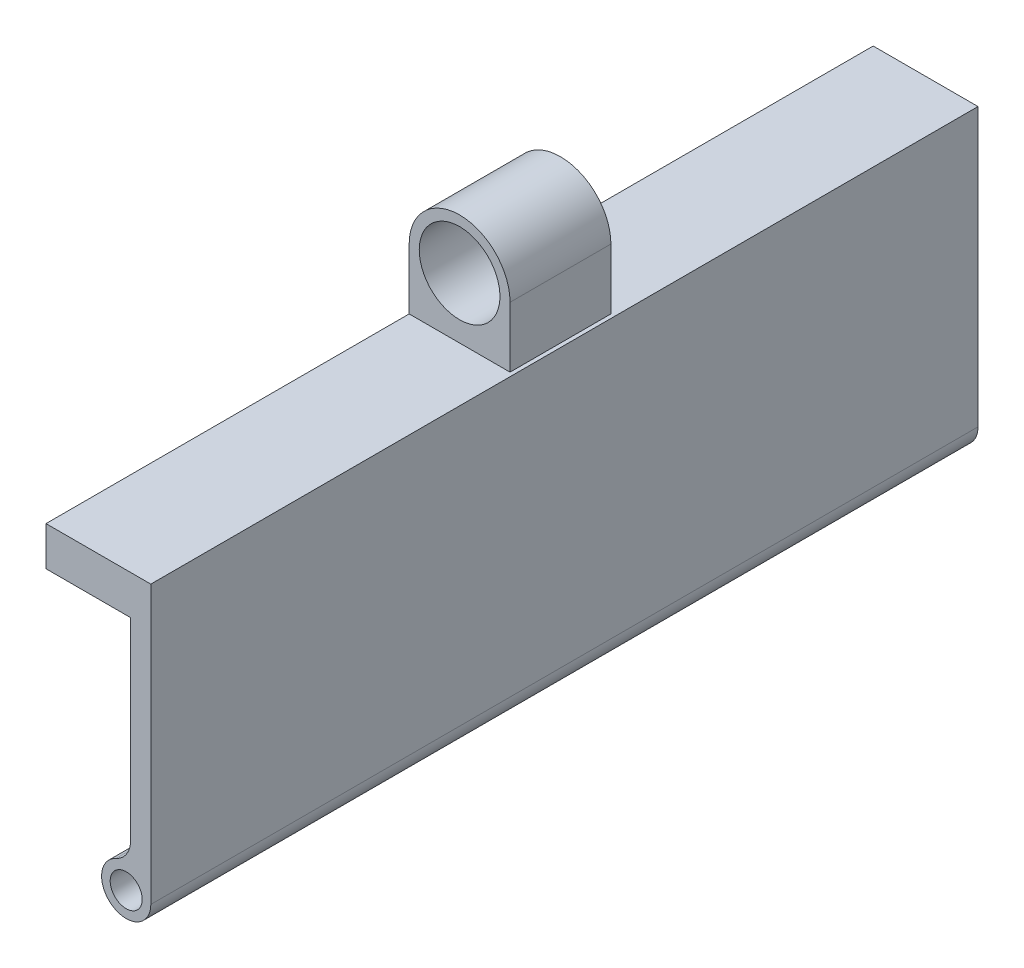
ISO-10303-21;
HEADER;
FILE_DESCRIPTION(('STEP AP214'),'2;1');
FILE_NAME('part.step','',(''),(''),'','','');
FILE_SCHEMA(('AUTOMOTIVE_DESIGN { 1 0 10303 214 1 1 1 1 }'));
ENDSEC;
DATA;
#1=APPLICATION_CONTEXT('core data for automotive mechanical design processes');
#2=APPLICATION_PROTOCOL_DEFINITION('international standard','automotive_design',2000,#1);
#3=PRODUCT_CONTEXT('',#1,'mechanical');
#4=PRODUCT('Part','Part','',(#3));
#5=PRODUCT_RELATED_PRODUCT_CATEGORY('part','',(#4));
#6=PRODUCT_DEFINITION_FORMATION('','',#4);
#7=PRODUCT_DEFINITION_CONTEXT('part definition',#1,'design');
#8=PRODUCT_DEFINITION('design','',#6,#7);
#9=PRODUCT_DEFINITION_SHAPE('','',#8);
#10=(LENGTH_UNIT() NAMED_UNIT(*) SI_UNIT(.MILLI.,.METRE.));
#11=(NAMED_UNIT(*) PLANE_ANGLE_UNIT() SI_UNIT($,.RADIAN.));
#12=(NAMED_UNIT(*) SI_UNIT($,.STERADIAN.) SOLID_ANGLE_UNIT());
#13=UNCERTAINTY_MEASURE_WITH_UNIT(LENGTH_MEASURE(1.E-05),#10,'distance_accuracy_value','');
#14=(GEOMETRIC_REPRESENTATION_CONTEXT(3) GLOBAL_UNCERTAINTY_ASSIGNED_CONTEXT((#13)) GLOBAL_UNIT_ASSIGNED_CONTEXT((#10,
#11,#12)) REPRESENTATION_CONTEXT('',''));
#15=CARTESIAN_POINT('',(0.,0.,0.));
#16=DIRECTION('',(0.,0.,1.));
#17=DIRECTION('',(1.,0.,0.));
#18=AXIS2_PLACEMENT_3D('',#15,#16,#17);
#19=CARTESIAN_POINT('',(0.,0.,82.));
#20=DIRECTION('',(0.,0.,-1.));
#21=DIRECTION('',(-1.,0.,0.));
#22=AXIS2_PLACEMENT_3D('',#19,#20,#21);
#23=CYLINDRICAL_SURFACE('',#22,2.44);
#24=DIRECTION('',(0.,0.,-1.));
#25=VECTOR('',#24,1.);
#26=CARTESIAN_POINT('',(-1.01748987854251,2.21772729321338,82.));
#27=LINE('',#26,#25);
#28=CARTESIAN_POINT('',(-1.01748987854251,2.21772729321338,58.60161));
#29=VERTEX_POINT('',#28);
#30=CARTESIAN_POINT('',(-1.01748987854251,2.21772729321338,46.881288));
#31=VERTEX_POINT('',#30);
#32=EDGE_CURVE('E425',#29,#31,#27,.T.);
#33=ORIENTED_EDGE('',*,*,#32,.T.);
#34=CARTESIAN_POINT('',(0.,0.,46.881288));
#35=DIRECTION('',(0.,0.,-1.));
#36=DIRECTION('',(-1.,0.,0.));
#37=AXIS2_PLACEMENT_3D('',#34,#35,#36);
#38=CIRCLE('',#37,2.44);
#39=CARTESIAN_POINT('',(0.44,-2.4,46.881288));
#40=VERTEX_POINT('',#39);
#41=EDGE_CURVE('E310',#40,#31,#38,.T.);
#42=ORIENTED_EDGE('',*,*,#41,.F.);
#43=DIRECTION('',(0.,0.,-1.));
#44=VECTOR('',#43,1.);
#45=CARTESIAN_POINT('',(0.44,-2.4,82.));
#46=LINE('',#45,#44);
#47=CARTESIAN_POINT('',(0.44,-2.4,35.160966));
#48=VERTEX_POINT('',#47);
#49=EDGE_CURVE('E316',#48,#40,#46,.F.);
#50=ORIENTED_EDGE('',*,*,#49,.F.);
#51=CARTESIAN_POINT('',(0.,0.,35.160966));
#52=DIRECTION('',(0.,0.,1.));
#53=DIRECTION('',(0.,-1.,0.));
#54=AXIS2_PLACEMENT_3D('',#51,#52,#53);
#55=CIRCLE('',#54,2.44);
#56=CARTESIAN_POINT('',(-1.01748987854251,2.21772729321338,35.160966));
#57=VERTEX_POINT('',#56);
#58=EDGE_CURVE('E231',#57,#48,#55,.T.);
#59=ORIENTED_EDGE('',*,*,#58,.F.);
#60=CARTESIAN_POINT('',(-1.01748987854251,2.21772729321338,23.440644));
#61=VERTEX_POINT('',#60);
#62=EDGE_CURVE('E230',#57,#61,#27,.T.);
#63=ORIENTED_EDGE('',*,*,#62,.T.);
#64=CARTESIAN_POINT('',(0.,0.,23.440644));
#65=DIRECTION('',(0.,0.,-1.));
#66=DIRECTION('',(-1.,0.,0.));
#67=AXIS2_PLACEMENT_3D('',#64,#65,#66);
#68=CIRCLE('',#67,2.44);
#69=CARTESIAN_POINT('',(0.44,-2.4,23.440644));
#70=VERTEX_POINT('',#69);
#71=EDGE_CURVE('E328',#70,#61,#68,.T.);
#72=ORIENTED_EDGE('',*,*,#71,.F.);
#73=DIRECTION('',(0.,0.,-1.));
#74=VECTOR('',#73,1.);
#75=CARTESIAN_POINT('',(0.44,-2.4,82.));
#76=LINE('',#75,#74);
#77=CARTESIAN_POINT('',(0.44,-2.4,11.720322));
#78=VERTEX_POINT('',#77);
#79=EDGE_CURVE('E324',#78,#70,#76,.F.);
#80=ORIENTED_EDGE('',*,*,#79,.F.);
#81=CARTESIAN_POINT('',(0.,0.,11.720322));
#82=DIRECTION('',(0.,0.,1.));
#83=DIRECTION('',(0.,-1.,0.));
#84=AXIS2_PLACEMENT_3D('',#81,#82,#83);
#85=CIRCLE('',#84,2.44);
#86=CARTESIAN_POINT('',(-1.01748987854251,2.21772729321338,11.720322));
#87=VERTEX_POINT('',#86);
#88=EDGE_CURVE('E334',#87,#78,#85,.T.);
#89=ORIENTED_EDGE('',*,*,#88,.F.);
#90=CARTESIAN_POINT('',(-1.01748987854251,2.21772729321338,0.));
#91=VERTEX_POINT('',#90);
#92=EDGE_CURVE('E416',#87,#91,#27,.T.);
#93=ORIENTED_EDGE('',*,*,#92,.T.);
#94=CARTESIAN_POINT('',(0.,0.,0.));
#95=DIRECTION('',(0.,0.,1.));
#96=DIRECTION('',(1.,0.,0.));
#97=AXIS2_PLACEMENT_3D('',#94,#95,#96);
#98=CIRCLE('',#97,2.44);
#99=CARTESIAN_POINT('',(2.44,0.,0.));
#100=VERTEX_POINT('',#99);
#101=EDGE_CURVE('E403',#91,#100,#98,.T.);
#102=ORIENTED_EDGE('',*,*,#101,.T.);
#103=DIRECTION('',(0.,0.,-1.));
#104=VECTOR('',#103,1.);
#105=CARTESIAN_POINT('',(2.44,0.,82.));
#106=LINE('',#105,#104);
#107=CARTESIAN_POINT('',(2.44,0.,82.));
#108=VERTEX_POINT('',#107);
#109=EDGE_CURVE('E247',#108,#100,#106,.T.);
#110=ORIENTED_EDGE('',*,*,#109,.F.);
#111=CARTESIAN_POINT('',(0.,0.,82.));
#112=DIRECTION('',(0.,0.,1.));
#113=DIRECTION('',(1.,0.,0.));
#114=AXIS2_PLACEMENT_3D('',#111,#112,#113);
#115=CIRCLE('',#114,2.44);
#116=CARTESIAN_POINT('',(-1.01748987854251,2.21772729321338,82.));
#117=VERTEX_POINT('',#116);
#118=EDGE_CURVE('E406',#117,#108,#115,.T.);
#119=ORIENTED_EDGE('',*,*,#118,.F.);
#120=CARTESIAN_POINT('',(-1.01748987854251,2.21772729321338,70.321932));
#121=VERTEX_POINT('',#120);
#122=EDGE_CURVE('E243',#117,#121,#27,.T.);
#123=ORIENTED_EDGE('',*,*,#122,.T.);
#124=CARTESIAN_POINT('',(0.,0.,70.321932));
#125=DIRECTION('',(0.,0.,-1.));
#126=DIRECTION('',(-1.,0.,0.));
#127=AXIS2_PLACEMENT_3D('',#124,#125,#126);
#128=CIRCLE('',#127,2.44);
#129=CARTESIAN_POINT('',(0.44,-2.4,70.321932));
#130=VERTEX_POINT('',#129);
#131=EDGE_CURVE('E296',#130,#121,#128,.T.);
#132=ORIENTED_EDGE('',*,*,#131,.F.);
#133=DIRECTION('',(0.,0.,-1.));
#134=VECTOR('',#133,1.);
#135=CARTESIAN_POINT('',(0.44,-2.4,82.));
#136=LINE('',#135,#134);
#137=CARTESIAN_POINT('',(0.44,-2.4,58.60161));
#138=VERTEX_POINT('',#137);
#139=EDGE_CURVE('E314',#138,#130,#136,.F.);
#140=ORIENTED_EDGE('',*,*,#139,.F.);
#141=CARTESIAN_POINT('',(0.,0.,58.60161));
#142=DIRECTION('',(0.,0.,1.));
#143=DIRECTION('',(0.,-1.,0.));
#144=AXIS2_PLACEMENT_3D('',#141,#142,#143);
#145=CIRCLE('',#144,2.44);
#146=EDGE_CURVE('E304',#29,#138,#145,.T.);
#147=ORIENTED_EDGE('',*,*,#146,.F.);
#148=EDGE_LOOP('',(#33,#42,#50,#59,#63,#72,#80,#89,#93,#102,#110,#119,#123,#132,#140,#147));
#149=FACE_BOUND('',#148,.T.);
#150=ADVANCED_FACE('F40',(#149),#23,.T.);
#151=CARTESIAN_POINT('',(-2.06,4.48998886412873,82.));
#152=DIRECTION('',(0.,0.,-1.));
#153=DIRECTION('',(-1.,0.,0.));
#154=AXIS2_PLACEMENT_3D('',#151,#152,#153);
#155=CYLINDRICAL_SURFACE('',#154,2.5);
#156=CARTESIAN_POINT('',(-2.06,4.48998886412873,35.160966));
#157=DIRECTION('',(0.,0.,1.));
#158=DIRECTION('',(0.,-1.,0.));
#159=AXIS2_PLACEMENT_3D('',#156,#157,#158);
#160=CIRCLE('',#159,2.5);
#161=CARTESIAN_POINT('',(0.44,4.48998886412873,35.160966));
#162=VERTEX_POINT('',#161);
#163=EDGE_CURVE('E215',#162,#57,#160,.F.);
#164=ORIENTED_EDGE('',*,*,#163,.F.);
#165=DIRECTION('',(0.,0.,-1.));
#166=VECTOR('',#165,1.);
#167=CARTESIAN_POINT('',(0.44,4.48998886412873,82.));
#168=LINE('',#167,#166);
#169=CARTESIAN_POINT('',(0.44,4.48998886412873,23.440644));
#170=VERTEX_POINT('',#169);
#171=EDGE_CURVE('E228',#162,#170,#168,.T.);
#172=ORIENTED_EDGE('',*,*,#171,.T.);
#173=CARTESIAN_POINT('',(-2.06,4.48998886412873,23.440644));
#174=DIRECTION('',(0.,0.,-1.));
#175=DIRECTION('',(-1.,0.,0.));
#176=AXIS2_PLACEMENT_3D('',#173,#174,#175);
#177=CIRCLE('',#176,2.5);
#178=EDGE_CURVE('E326',#61,#170,#177,.F.);
#179=ORIENTED_EDGE('',*,*,#178,.F.);
#180=ORIENTED_EDGE('',*,*,#62,.F.);
#181=EDGE_LOOP('',(#164,#172,#179,#180));
#182=FACE_BOUND('',#181,.T.);
#183=ADVANCED_FACE('F226',(#182),#155,.F.);
#184=CARTESIAN_POINT('',(-2.06,4.48998886412873,46.881288));
#185=DIRECTION('',(0.,0.,-1.));
#186=DIRECTION('',(-1.,0.,0.));
#187=AXIS2_PLACEMENT_3D('',#184,#185,#186);
#188=CIRCLE('',#187,2.5);
#189=CARTESIAN_POINT('',(0.44,4.48998886412873,46.881288));
#190=VERTEX_POINT('',#189);
#191=EDGE_CURVE('E307',#31,#190,#188,.F.);
#192=ORIENTED_EDGE('',*,*,#191,.F.);
#193=ORIENTED_EDGE('',*,*,#32,.F.);
#194=CARTESIAN_POINT('',(-2.06,4.48998886412873,58.60161));
#195=DIRECTION('',(0.,0.,1.));
#196=DIRECTION('',(0.,-1.,0.));
#197=AXIS2_PLACEMENT_3D('',#194,#195,#196);
#198=CIRCLE('',#197,2.5);
#199=CARTESIAN_POINT('',(0.44,4.48998886412873,58.60161));
#200=VERTEX_POINT('',#199);
#201=EDGE_CURVE('E301',#200,#29,#198,.F.);
#202=ORIENTED_EDGE('',*,*,#201,.F.);
#203=EDGE_CURVE('E238',#200,#190,#168,.T.);
#204=ORIENTED_EDGE('',*,*,#203,.T.);
#205=EDGE_LOOP('',(#192,#193,#202,#204));
#206=FACE_BOUND('',#205,.T.);
#207=ADVANCED_FACE('F473',(#206),#155,.F.);
#208=CARTESIAN_POINT('',(-2.06,4.48998886412873,70.321932));
#209=DIRECTION('',(0.,0.,-1.));
#210=DIRECTION('',(-1.,0.,0.));
#211=AXIS2_PLACEMENT_3D('',#208,#209,#210);
#212=CIRCLE('',#211,2.5);
#213=CARTESIAN_POINT('',(0.44,4.48998886412873,70.321932));
#214=VERTEX_POINT('',#213);
#215=EDGE_CURVE('E293',#121,#214,#212,.F.);
#216=ORIENTED_EDGE('',*,*,#215,.F.);
#217=ORIENTED_EDGE('',*,*,#122,.F.);
#218=CARTESIAN_POINT('',(-2.06,4.48998886412873,82.));
#219=DIRECTION('',(0.,0.,-1.));
#220=DIRECTION('',(-1.,0.,0.));
#221=AXIS2_PLACEMENT_3D('',#218,#219,#220);
#222=CIRCLE('',#221,2.5);
#223=CARTESIAN_POINT('',(0.44,4.48998886412873,82.));
#224=VERTEX_POINT('',#223);
#225=EDGE_CURVE('E414',#224,#117,#222,.T.);
#226=ORIENTED_EDGE('',*,*,#225,.F.);
#227=EDGE_CURVE('E241',#224,#214,#168,.T.);
#228=ORIENTED_EDGE('',*,*,#227,.T.);
#229=EDGE_LOOP('',(#216,#217,#226,#228));
#230=FACE_BOUND('',#229,.T.);
#231=ADVANCED_FACE('F457',(#230),#155,.F.);
#232=CARTESIAN_POINT('',(0.,0.,82.));
#233=DIRECTION('',(0.,0.,-1.));
#234=DIRECTION('',(-1.,0.,0.));
#235=AXIS2_PLACEMENT_3D('',#232,#233,#234);
#236=CYLINDRICAL_SURFACE('',#235,1.5875);
#237=CARTESIAN_POINT('',(0.,0.,82.));
#238=DIRECTION('',(0.,0.,1.));
#239=DIRECTION('',(1.,0.,0.));
#240=AXIS2_PLACEMENT_3D('',#237,#238,#239);
#241=CIRCLE('',#240,1.5875);
#242=CARTESIAN_POINT('',(1.5875,0.,82.));
#243=VERTEX_POINT('',#242);
#244=EDGE_CURVE('E400',#243,#243,#241,.T.);
#245=ORIENTED_EDGE('',*,*,#244,.T.);
#246=EDGE_LOOP('',(#245));
#247=FACE_BOUND('',#246,.T.);
#248=CARTESIAN_POINT('',(0.,0.,0.));
#249=DIRECTION('',(0.,0.,1.));
#250=DIRECTION('',(1.,0.,0.));
#251=AXIS2_PLACEMENT_3D('',#248,#249,#250);
#252=CIRCLE('',#251,1.5875);
#253=CARTESIAN_POINT('',(1.5875,0.,0.));
#254=VERTEX_POINT('',#253);
#255=EDGE_CURVE('E399',#254,#254,#252,.T.);
#256=ORIENTED_EDGE('',*,*,#255,.F.);
#257=EDGE_LOOP('',(#256));
#258=FACE_BOUND('',#257,.T.);
#259=CARTESIAN_POINT('',(0.,0.,23.440644));
#260=DIRECTION('',(0.,0.,-1.));
#261=DIRECTION('',(-1.,0.,0.));
#262=AXIS2_PLACEMENT_3D('',#259,#260,#261);
#263=CIRCLE('',#262,1.5875);
#264=CARTESIAN_POINT('',(0.44,-1.52530529730936,23.440644));
#265=VERTEX_POINT('',#264);
#266=CARTESIAN_POINT('',(0.44,1.52530529730936,23.440644));
#267=VERTEX_POINT('',#266);
#268=EDGE_CURVE('E258',#265,#267,#263,.T.);
#269=ORIENTED_EDGE('',*,*,#268,.T.);
#270=DIRECTION('',(0.,0.,-1.));
#271=VECTOR('',#270,1.);
#272=CARTESIAN_POINT('',(0.44,1.52530529730936,82.));
#273=LINE('',#272,#271);
#274=CARTESIAN_POINT('',(0.44,1.52530529730936,11.720322));
#275=VERTEX_POINT('',#274);
#276=EDGE_CURVE('E266',#267,#275,#273,.T.);
#277=ORIENTED_EDGE('',*,*,#276,.T.);
#278=CARTESIAN_POINT('',(0.,0.,11.720322));
#279=DIRECTION('',(0.,0.,1.));
#280=DIRECTION('',(0.,-1.,0.));
#281=AXIS2_PLACEMENT_3D('',#278,#279,#280);
#282=CIRCLE('',#281,1.5875);
#283=CARTESIAN_POINT('',(0.44,-1.52530529730936,11.720322));
#284=VERTEX_POINT('',#283);
#285=EDGE_CURVE('E263',#275,#284,#282,.T.);
#286=ORIENTED_EDGE('',*,*,#285,.T.);
#287=DIRECTION('',(0.,0.,-1.));
#288=VECTOR('',#287,1.);
#289=CARTESIAN_POINT('',(0.44,-1.52530529730936,82.));
#290=LINE('',#289,#288);
#291=EDGE_CURVE('E253',#284,#265,#290,.F.);
#292=ORIENTED_EDGE('',*,*,#291,.T.);
#293=EDGE_LOOP('',(#269,#277,#286,#292));
#294=FACE_BOUND('',#293,.T.);
#295=CARTESIAN_POINT('',(0.,0.,70.321932));
#296=DIRECTION('',(0.,0.,-1.));
#297=DIRECTION('',(-1.,0.,0.));
#298=AXIS2_PLACEMENT_3D('',#295,#296,#297);
#299=CIRCLE('',#298,1.5875);
#300=CARTESIAN_POINT('',(0.44,-1.52530529730936,70.321932));
#301=VERTEX_POINT('',#300);
#302=CARTESIAN_POINT('',(0.44,1.52530529730936,70.321932));
#303=VERTEX_POINT('',#302);
#304=EDGE_CURVE('E290',#301,#303,#299,.T.);
#305=ORIENTED_EDGE('',*,*,#304,.T.);
#306=DIRECTION('',(0.,0.,-1.));
#307=VECTOR('',#306,1.);
#308=CARTESIAN_POINT('',(0.44,1.52530529730936,82.));
#309=LINE('',#308,#307);
#310=CARTESIAN_POINT('',(0.44,1.52530529730936,58.60161));
#311=VERTEX_POINT('',#310);
#312=EDGE_CURVE('E272',#303,#311,#309,.T.);
#313=ORIENTED_EDGE('',*,*,#312,.T.);
#314=CARTESIAN_POINT('',(0.,0.,58.60161));
#315=DIRECTION('',(0.,0.,1.));
#316=DIRECTION('',(0.,-1.,0.));
#317=AXIS2_PLACEMENT_3D('',#314,#315,#316);
#318=CIRCLE('',#317,1.5875);
#319=CARTESIAN_POINT('',(0.44,-1.52530529730936,58.60161));
#320=VERTEX_POINT('',#319);
#321=EDGE_CURVE('E298',#311,#320,#318,.T.);
#322=ORIENTED_EDGE('',*,*,#321,.T.);
#323=DIRECTION('',(0.,0.,-1.));
#324=VECTOR('',#323,1.);
#325=CARTESIAN_POINT('',(0.44,-1.52530529730936,82.));
#326=LINE('',#325,#324);
#327=EDGE_CURVE('E269',#320,#301,#326,.F.);
#328=ORIENTED_EDGE('',*,*,#327,.T.);
#329=EDGE_LOOP('',(#305,#313,#322,#328));
#330=FACE_BOUND('',#329,.T.);
#331=CARTESIAN_POINT('',(0.,0.,46.881288));
#332=DIRECTION('',(0.,0.,-1.));
#333=DIRECTION('',(-1.,0.,0.));
#334=AXIS2_PLACEMENT_3D('',#331,#332,#333);
#335=CIRCLE('',#334,1.5875);
#336=CARTESIAN_POINT('',(0.44,-1.52530529730936,46.881288));
#337=VERTEX_POINT('',#336);
#338=CARTESIAN_POINT('',(0.44,1.52530529730936,46.881288));
#339=VERTEX_POINT('',#338);
#340=EDGE_CURVE('E278',#337,#339,#335,.T.);
#341=ORIENTED_EDGE('',*,*,#340,.T.);
#342=DIRECTION('',(0.,0.,-1.));
#343=VECTOR('',#342,1.);
#344=CARTESIAN_POINT('',(0.44,1.52530529730936,82.));
#345=LINE('',#344,#343);
#346=CARTESIAN_POINT('',(0.44,1.52530529730936,35.160966));
#347=VERTEX_POINT('',#346);
#348=EDGE_CURVE('E11',#339,#347,#345,.T.);
#349=ORIENTED_EDGE('',*,*,#348,.T.);
#350=CARTESIAN_POINT('',(0.,0.,35.160966));
#351=DIRECTION('',(0.,0.,1.));
#352=DIRECTION('',(0.,-1.,0.));
#353=AXIS2_PLACEMENT_3D('',#350,#351,#352);
#354=CIRCLE('',#353,1.5875);
#355=CARTESIAN_POINT('',(0.44,-1.52530529730936,35.160966));
#356=VERTEX_POINT('',#355);
#357=EDGE_CURVE('E219',#347,#356,#354,.T.);
#358=ORIENTED_EDGE('',*,*,#357,.T.);
#359=DIRECTION('',(0.,0.,-1.));
#360=VECTOR('',#359,1.);
#361=CARTESIAN_POINT('',(0.44,-1.52530529730936,82.));
#362=LINE('',#361,#360);
#363=EDGE_CURVE('E47',#356,#337,#362,.F.);
#364=ORIENTED_EDGE('',*,*,#363,.T.);
#365=EDGE_LOOP('',(#341,#349,#358,#364));
#366=FACE_BOUND('',#365,.T.);
#367=ADVANCED_FACE('F277',(#247,#258,#294,#330,#366),#236,.F.);
#368=CARTESIAN_POINT('',(-2.06,4.48998886412873,11.720322));
#369=DIRECTION('',(0.,0.,1.));
#370=DIRECTION('',(0.,-1.,0.));
#371=AXIS2_PLACEMENT_3D('',#368,#369,#370);
#372=CIRCLE('',#371,2.5);
#373=CARTESIAN_POINT('',(0.44,4.48998886412873,11.720322));
#374=VERTEX_POINT('',#373);
#375=EDGE_CURVE('E331',#374,#87,#372,.F.);
#376=ORIENTED_EDGE('',*,*,#375,.F.);
#377=CARTESIAN_POINT('',(0.44,4.48998886412873,0.));
#378=VERTEX_POINT('',#377);
#379=EDGE_CURVE('E239',#374,#378,#168,.T.);
#380=ORIENTED_EDGE('',*,*,#379,.T.);
#381=CARTESIAN_POINT('',(-2.06,4.48998886412873,0.));
#382=DIRECTION('',(0.,0.,-1.));
#383=DIRECTION('',(-1.,0.,0.));
#384=AXIS2_PLACEMENT_3D('',#381,#382,#383);
#385=CIRCLE('',#384,2.5);
#386=EDGE_CURVE('E410',#378,#91,#385,.T.);
#387=ORIENTED_EDGE('',*,*,#386,.T.);
#388=ORIENTED_EDGE('',*,*,#92,.F.);
#389=EDGE_LOOP('',(#376,#380,#387,#388));
#390=FACE_BOUND('',#389,.T.);
#391=ADVANCED_FACE('F437',(#390),#155,.F.);
#392=CARTESIAN_POINT('',(0.,27.5,0.));
#393=DIRECTION('',(0.,-1.,0.));
#394=DIRECTION('',(0.,0.,-1.));
#395=AXIS2_PLACEMENT_3D('',#392,#393,#394);
#396=PLANE('',#395);
#397=DIRECTION('',(-1.,0.,0.));
#398=VECTOR('',#397,1.);
#399=CARTESIAN_POINT('',(-7.95000000000001,27.5,36.));
#400=LINE('',#399,#398);
#401=CARTESIAN_POINT('',(2.04999999999999,27.5,36.));
#402=VERTEX_POINT('',#401);
#403=CARTESIAN_POINT('',(-7.95000000000001,27.5,36.));
#404=VERTEX_POINT('',#403);
#405=EDGE_CURVE('E340',#402,#404,#400,.T.);
#406=ORIENTED_EDGE('',*,*,#405,.F.);
#407=DIRECTION('',(0.,0.,-1.));
#408=VECTOR('',#407,1.);
#409=CARTESIAN_POINT('',(2.04999999999999,27.5,46.));
#410=LINE('',#409,#408);
#411=CARTESIAN_POINT('',(2.04999999999999,27.5,46.));
#412=VERTEX_POINT('',#411);
#413=EDGE_CURVE('E367',#412,#402,#410,.T.);
#414=ORIENTED_EDGE('',*,*,#413,.F.);
#415=DIRECTION('',(-1.,0.,0.));
#416=VECTOR('',#415,1.);
#417=CARTESIAN_POINT('',(-7.95000000000001,27.5,46.));
#418=LINE('',#417,#416);
#419=CARTESIAN_POINT('',(-7.95,27.5,46.));
#420=VERTEX_POINT('',#419);
#421=EDGE_CURVE('E343',#412,#420,#418,.T.);
#422=ORIENTED_EDGE('',*,*,#421,.T.);
#423=DIRECTION('',(0.,0.,-1.));
#424=VECTOR('',#423,1.);
#425=CARTESIAN_POINT('',(-7.95,27.5,82.));
#426=LINE('',#425,#424);
#427=CARTESIAN_POINT('',(-7.95,27.5,82.));
#428=VERTEX_POINT('',#427);
#429=EDGE_CURVE('E377',#428,#420,#426,.T.);
#430=ORIENTED_EDGE('',*,*,#429,.F.);
#431=DIRECTION('',(1.,0.,0.));
#432=VECTOR('',#431,1.);
#433=CARTESIAN_POINT('',(0.44,27.5,82.));
#434=LINE('',#433,#432);
#435=CARTESIAN_POINT('',(2.44,27.5,82.));
#436=VERTEX_POINT('',#435);
#437=EDGE_CURVE('E390',#428,#436,#434,.T.);
#438=ORIENTED_EDGE('',*,*,#437,.T.);
#439=DIRECTION('',(0.,0.,-1.));
#440=VECTOR('',#439,1.);
#441=CARTESIAN_POINT('',(2.44,27.5,82.));
#442=LINE('',#441,#440);
#443=CARTESIAN_POINT('',(2.44,27.5,0.));
#444=VERTEX_POINT('',#443);
#445=EDGE_CURVE('E393',#436,#444,#442,.T.);
#446=ORIENTED_EDGE('',*,*,#445,.T.);
#447=DIRECTION('',(-1.,0.,0.));
#448=VECTOR('',#447,1.);
#449=CARTESIAN_POINT('',(0.44,27.5,0.));
#450=LINE('',#449,#448);
#451=CARTESIAN_POINT('',(-7.95,27.5,0.));
#452=VERTEX_POINT('',#451);
#453=EDGE_CURVE('E396',#444,#452,#450,.T.);
#454=ORIENTED_EDGE('',*,*,#453,.T.);
#455=EDGE_CURVE('E376',#404,#452,#426,.T.);
#456=ORIENTED_EDGE('',*,*,#455,.F.);
#457=EDGE_LOOP('',(#406,#414,#422,#430,#438,#446,#454,#456));
#458=FACE_BOUND('',#457,.T.);
#459=ADVANCED_FACE('F449',(#458),#396,.F.);
#460=CARTESIAN_POINT('',(0.44,4.48998886412873,82.));
#461=DIRECTION('',(1.,0.,0.));
#462=DIRECTION('',(0.,0.,-1.));
#463=AXIS2_PLACEMENT_3D('',#460,#461,#462);
#464=PLANE('',#463);
#465=DIRECTION('',(0.,0.,1.));
#466=VECTOR('',#465,1.);
#467=CARTESIAN_POINT('',(0.44,23.619265905383,82.));
#468=LINE('',#467,#466);
#469=CARTESIAN_POINT('',(0.44,23.619265905383,0.));
#470=VERTEX_POINT('',#469);
#471=CARTESIAN_POINT('',(0.44,23.619265905383,82.));
#472=VERTEX_POINT('',#471);
#473=EDGE_CURVE('E369',#470,#472,#468,.T.);
#474=ORIENTED_EDGE('',*,*,#473,.F.);
#475=DIRECTION('',(0.,-1.,0.));
#476=VECTOR('',#475,1.);
#477=CARTESIAN_POINT('',(0.44,4.48998886412873,0.));
#478=LINE('',#477,#476);
#479=EDGE_CURVE('E420',#470,#378,#478,.T.);
#480=ORIENTED_EDGE('',*,*,#479,.T.);
#481=ORIENTED_EDGE('',*,*,#379,.F.);
#482=DIRECTION('',(0.,-1.,0.));
#483=VECTOR('',#482,1.);
#484=CARTESIAN_POINT('',(0.44,4.48998886412873,11.720322));
#485=LINE('',#484,#483);
#486=EDGE_CURVE('E319',#374,#275,#485,.T.);
#487=ORIENTED_EDGE('',*,*,#486,.T.);
#488=ORIENTED_EDGE('',*,*,#276,.F.);
#489=DIRECTION('',(0.,1.,0.));
#490=VECTOR('',#489,1.);
#491=CARTESIAN_POINT('',(0.44,4.48998886412873,23.440644));
#492=LINE('',#491,#490);
#493=EDGE_CURVE('E236',#267,#170,#492,.T.);
#494=ORIENTED_EDGE('',*,*,#493,.T.);
#495=ORIENTED_EDGE('',*,*,#171,.F.);
#496=DIRECTION('',(0.,-1.,0.));
#497=VECTOR('',#496,1.);
#498=CARTESIAN_POINT('',(0.44,4.48998886412873,35.160966));
#499=LINE('',#498,#497);
#500=EDGE_CURVE('E212',#162,#347,#499,.T.);
#501=ORIENTED_EDGE('',*,*,#500,.T.);
#502=ORIENTED_EDGE('',*,*,#348,.F.);
#503=DIRECTION('',(0.,1.,0.));
#504=VECTOR('',#503,1.);
#505=CARTESIAN_POINT('',(0.44,4.48998886412873,46.881288));
#506=LINE('',#505,#504);
#507=EDGE_CURVE('E222',#339,#190,#506,.T.);
#508=ORIENTED_EDGE('',*,*,#507,.T.);
#509=ORIENTED_EDGE('',*,*,#203,.F.);
#510=DIRECTION('',(0.,-1.,0.));
#511=VECTOR('',#510,1.);
#512=CARTESIAN_POINT('',(0.44,4.48998886412873,58.60161));
#513=LINE('',#512,#511);
#514=EDGE_CURVE('E286',#200,#311,#513,.T.);
#515=ORIENTED_EDGE('',*,*,#514,.T.);
#516=ORIENTED_EDGE('',*,*,#312,.F.);
#517=DIRECTION('',(0.,1.,0.));
#518=VECTOR('',#517,1.);
#519=CARTESIAN_POINT('',(0.44,4.48998886412873,70.321932));
#520=LINE('',#519,#518);
#521=EDGE_CURVE('E282',#303,#214,#520,.T.);
#522=ORIENTED_EDGE('',*,*,#521,.T.);
#523=ORIENTED_EDGE('',*,*,#227,.F.);
#524=DIRECTION('',(0.,-1.,0.));
#525=VECTOR('',#524,1.);
#526=CARTESIAN_POINT('',(0.44,4.48998886412873,82.));
#527=LINE('',#526,#525);
#528=EDGE_CURVE('E412',#472,#224,#527,.T.);
#529=ORIENTED_EDGE('',*,*,#528,.F.);
#530=EDGE_LOOP('',(#474,#480,#481,#487,#488,#494,#495,#501,#502,#508,#509,#515,#516,#522,#523,#529));
#531=FACE_BOUND('',#530,.T.);
#532=ADVANCED_FACE('F234',(#531),#464,.F.);
#533=CARTESIAN_POINT('',(0.,0.,82.));
#534=DIRECTION('',(0.,0.,1.));
#535=DIRECTION('',(1.,0.,0.));
#536=AXIS2_PLACEMENT_3D('',#533,#534,#535);
#537=PLANE('',#536);
#538=ORIENTED_EDGE('',*,*,#118,.T.);
#539=DIRECTION('',(0.,1.,0.));
#540=VECTOR('',#539,1.);
#541=CARTESIAN_POINT('',(2.44,0.,82.));
#542=LINE('',#541,#540);
#543=EDGE_CURVE('E409',#108,#436,#542,.T.);
#544=ORIENTED_EDGE('',*,*,#543,.T.);
#545=ORIENTED_EDGE('',*,*,#437,.F.);
#546=DIRECTION('',(0.,1.,0.));
#547=VECTOR('',#546,1.);
#548=CARTESIAN_POINT('',(-7.95,27.5,82.));
#549=LINE('',#548,#547);
#550=CARTESIAN_POINT('',(-7.95,23.619265905383,82.));
#551=VERTEX_POINT('',#550);
#552=EDGE_CURVE('E373',#551,#428,#549,.T.);
#553=ORIENTED_EDGE('',*,*,#552,.F.);
#554=DIRECTION('',(1.,0.,0.));
#555=VECTOR('',#554,1.);
#556=CARTESIAN_POINT('',(-7.95,23.619265905383,82.));
#557=LINE('',#556,#555);
#558=EDGE_CURVE('E384',#551,#472,#557,.T.);
#559=ORIENTED_EDGE('',*,*,#558,.T.);
#560=ORIENTED_EDGE('',*,*,#528,.T.);
#561=ORIENTED_EDGE('',*,*,#225,.T.);
#562=EDGE_LOOP('',(#538,#544,#545,#553,#559,#560,#561));
#563=FACE_BOUND('',#562,.T.);
#564=ORIENTED_EDGE('',*,*,#244,.F.);
#565=EDGE_LOOP('',(#564));
#566=FACE_BOUND('',#565,.T.);
#567=ADVANCED_FACE('F454',(#563,#566),#537,.T.);
#568=CARTESIAN_POINT('',(0.,0.,0.));
#569=DIRECTION('',(0.,0.,1.));
#570=DIRECTION('',(1.,0.,0.));
#571=AXIS2_PLACEMENT_3D('',#568,#569,#570);
#572=PLANE('',#571);
#573=ORIENTED_EDGE('',*,*,#101,.F.);
#574=ORIENTED_EDGE('',*,*,#386,.F.);
#575=ORIENTED_EDGE('',*,*,#479,.F.);
#576=DIRECTION('',(1.,0.,0.));
#577=VECTOR('',#576,1.);
#578=CARTESIAN_POINT('',(-7.95,23.619265905383,0.));
#579=LINE('',#578,#577);
#580=CARTESIAN_POINT('',(-7.95,23.619265905383,0.));
#581=VERTEX_POINT('',#580);
#582=EDGE_CURVE('E388',#581,#470,#579,.T.);
#583=ORIENTED_EDGE('',*,*,#582,.F.);
#584=DIRECTION('',(0.,-1.,0.));
#585=VECTOR('',#584,1.);
#586=CARTESIAN_POINT('',(-7.95,27.5,0.));
#587=LINE('',#586,#585);
#588=EDGE_CURVE('E380',#452,#581,#587,.T.);
#589=ORIENTED_EDGE('',*,*,#588,.F.);
#590=ORIENTED_EDGE('',*,*,#453,.F.);
#591=DIRECTION('',(0.,1.,0.));
#592=VECTOR('',#591,1.);
#593=CARTESIAN_POINT('',(2.44,0.,0.));
#594=LINE('',#593,#592);
#595=EDGE_CURVE('E418',#100,#444,#594,.T.);
#596=ORIENTED_EDGE('',*,*,#595,.F.);
#597=EDGE_LOOP('',(#573,#574,#575,#583,#589,#590,#596));
#598=FACE_BOUND('',#597,.T.);
#599=ORIENTED_EDGE('',*,*,#255,.T.);
#600=EDGE_LOOP('',(#599));
#601=FACE_BOUND('',#600,.T.);
#602=ADVANCED_FACE('F441',(#598,#601),#572,.F.);
#603=CARTESIAN_POINT('',(2.44,0.,82.));
#604=DIRECTION('',(-1.,0.,0.));
#605=DIRECTION('',(0.,0.,1.));
#606=AXIS2_PLACEMENT_3D('',#603,#604,#605);
#607=PLANE('',#606);
#608=ORIENTED_EDGE('',*,*,#595,.T.);
#609=ORIENTED_EDGE('',*,*,#445,.F.);
#610=ORIENTED_EDGE('',*,*,#543,.F.);
#611=ORIENTED_EDGE('',*,*,#109,.T.);
#612=EDGE_LOOP('',(#608,#609,#610,#611));
#613=FACE_BOUND('',#612,.T.);
#614=ADVANCED_FACE('F446',(#613),#607,.F.);
#615=CARTESIAN_POINT('',(-7.95,23.619265905383,82.));
#616=DIRECTION('',(0.,1.,0.));
#617=DIRECTION('',(0.,0.,1.));
#618=AXIS2_PLACEMENT_3D('',#615,#616,#617);
#619=PLANE('',#618);
#620=ORIENTED_EDGE('',*,*,#473,.T.);
#621=ORIENTED_EDGE('',*,*,#558,.F.);
#622=DIRECTION('',(0.,0.,1.));
#623=VECTOR('',#622,1.);
#624=CARTESIAN_POINT('',(-7.95,23.619265905383,82.));
#625=LINE('',#624,#623);
#626=EDGE_CURVE('E382',#581,#551,#625,.T.);
#627=ORIENTED_EDGE('',*,*,#626,.F.);
#628=ORIENTED_EDGE('',*,*,#582,.T.);
#629=EDGE_LOOP('',(#620,#621,#627,#628));
#630=FACE_BOUND('',#629,.T.);
#631=ADVANCED_FACE('F604',(#630),#619,.F.);
#632=CARTESIAN_POINT('',(-7.95,0.,0.));
#633=DIRECTION('',(1.,0.,0.));
#634=DIRECTION('',(0.,0.,-1.));
#635=AXIS2_PLACEMENT_3D('',#632,#633,#634);
#636=PLANE('',#635);
#637=ORIENTED_EDGE('',*,*,#552,.T.);
#638=ORIENTED_EDGE('',*,*,#429,.T.);
#639=DIRECTION('',(0.,1.,0.));
#640=VECTOR('',#639,1.);
#641=CARTESIAN_POINT('',(-7.95000000000001,27.5,46.));
#642=LINE('',#641,#640);
#643=CARTESIAN_POINT('',(-7.95000000000001,33.5,46.));
#644=VERTEX_POINT('',#643);
#645=EDGE_CURVE('E346',#420,#644,#642,.T.);
#646=ORIENTED_EDGE('',*,*,#645,.T.);
#647=DIRECTION('',(0.,0.,-1.));
#648=VECTOR('',#647,1.);
#649=CARTESIAN_POINT('',(-7.95000000000001,33.5,46.));
#650=LINE('',#649,#648);
#651=CARTESIAN_POINT('',(-7.95000000000001,33.5,36.));
#652=VERTEX_POINT('',#651);
#653=EDGE_CURVE('E356',#644,#652,#650,.T.);
#654=ORIENTED_EDGE('',*,*,#653,.T.);
#655=DIRECTION('',(0.,1.,0.));
#656=VECTOR('',#655,1.);
#657=CARTESIAN_POINT('',(-7.95000000000001,27.5,36.));
#658=LINE('',#657,#656);
#659=EDGE_CURVE('E359',#404,#652,#658,.T.);
#660=ORIENTED_EDGE('',*,*,#659,.F.);
#661=ORIENTED_EDGE('',*,*,#455,.T.);
#662=ORIENTED_EDGE('',*,*,#588,.T.);
#663=ORIENTED_EDGE('',*,*,#626,.T.);
#664=EDGE_LOOP('',(#637,#638,#646,#654,#660,#661,#662,#663));
#665=FACE_BOUND('',#664,.T.);
#666=ADVANCED_FACE('F597',(#665),#636,.F.);
#667=CARTESIAN_POINT('',(2.04999999999999,33.5,46.));
#668=DIRECTION('',(1.,0.,0.));
#669=DIRECTION('',(0.,0.,-1.));
#670=AXIS2_PLACEMENT_3D('',#667,#668,#669);
#671=PLANE('',#670);
#672=DIRECTION('',(0.,-1.,0.));
#673=VECTOR('',#672,1.);
#674=CARTESIAN_POINT('',(2.04999999999999,33.5,36.));
#675=LINE('',#674,#673);
#676=CARTESIAN_POINT('',(2.04999999999999,33.5,36.));
#677=VERTEX_POINT('',#676);
#678=EDGE_CURVE('E347',#677,#402,#675,.T.);
#679=ORIENTED_EDGE('',*,*,#678,.F.);
#680=DIRECTION('',(0.,0.,-1.));
#681=VECTOR('',#680,1.);
#682=CARTESIAN_POINT('',(2.04999999999999,33.5,46.));
#683=LINE('',#682,#681);
#684=CARTESIAN_POINT('',(2.04999999999999,33.5,46.));
#685=VERTEX_POINT('',#684);
#686=EDGE_CURVE('E370',#685,#677,#683,.T.);
#687=ORIENTED_EDGE('',*,*,#686,.F.);
#688=DIRECTION('',(0.,-1.,0.));
#689=VECTOR('',#688,1.);
#690=CARTESIAN_POINT('',(2.04999999999999,33.5,46.));
#691=LINE('',#690,#689);
#692=EDGE_CURVE('E353',#685,#412,#691,.T.);
#693=ORIENTED_EDGE('',*,*,#692,.T.);
#694=ORIENTED_EDGE('',*,*,#413,.T.);
#695=EDGE_LOOP('',(#679,#687,#693,#694));
#696=FACE_BOUND('',#695,.T.);
#697=ADVANCED_FACE('F594',(#696),#671,.T.);
#698=CARTESIAN_POINT('',(-2.95000000000001,33.5,46.));
#699=DIRECTION('',(0.,0.,-1.));
#700=DIRECTION('',(-1.,0.,0.));
#701=AXIS2_PLACEMENT_3D('',#698,#699,#700);
#702=CYLINDRICAL_SURFACE('',#701,5.);
#703=CARTESIAN_POINT('',(-2.95000000000001,33.5,36.));
#704=DIRECTION('',(0.,0.,-1.));
#705=DIRECTION('',(-1.,0.,0.));
#706=AXIS2_PLACEMENT_3D('',#703,#704,#705);
#707=CIRCLE('',#706,5.);
#708=EDGE_CURVE('E362',#652,#677,#707,.T.);
#709=ORIENTED_EDGE('',*,*,#708,.F.);
#710=ORIENTED_EDGE('',*,*,#653,.F.);
#711=CARTESIAN_POINT('',(-2.95000000000001,33.5,46.));
#712=DIRECTION('',(0.,0.,-1.));
#713=DIRECTION('',(-1.,0.,0.));
#714=AXIS2_PLACEMENT_3D('',#711,#712,#713);
#715=CIRCLE('',#714,5.);
#716=EDGE_CURVE('E350',#644,#685,#715,.T.);
#717=ORIENTED_EDGE('',*,*,#716,.T.);
#718=ORIENTED_EDGE('',*,*,#686,.T.);
#719=EDGE_LOOP('',(#709,#710,#717,#718));
#720=FACE_BOUND('',#719,.T.);
#721=ADVANCED_FACE('F589',(#720),#702,.T.);
#722=CARTESIAN_POINT('',(-2.95000000000001,33.5,46.));
#723=DIRECTION('',(0.,0.,-1.));
#724=DIRECTION('',(-1.,0.,0.));
#725=AXIS2_PLACEMENT_3D('',#722,#723,#724);
#726=PLANE('',#725);
#727=CARTESIAN_POINT('',(-2.95000000000001,33.5,46.));
#728=DIRECTION('',(0.,0.,-1.));
#729=DIRECTION('',(-1.,0.,0.));
#730=AXIS2_PLACEMENT_3D('',#727,#728,#729);
#731=CIRCLE('',#730,4.);
#732=CARTESIAN_POINT('',(-6.95,33.5,46.));
#733=VERTEX_POINT('',#732);
#734=EDGE_CURVE('E337',#733,#733,#731,.T.);
#735=ORIENTED_EDGE('',*,*,#734,.T.);
#736=EDGE_LOOP('',(#735));
#737=FACE_BOUND('',#736,.T.);
#738=ORIENTED_EDGE('',*,*,#421,.F.);
#739=ORIENTED_EDGE('',*,*,#692,.F.);
#740=ORIENTED_EDGE('',*,*,#716,.F.);
#741=ORIENTED_EDGE('',*,*,#645,.F.);
#742=EDGE_LOOP('',(#738,#739,#740,#741));
#743=FACE_BOUND('',#742,.T.);
#744=ADVANCED_FACE('F586',(#737,#743),#726,.F.);
#745=CARTESIAN_POINT('',(-2.95000000000001,33.5,36.));
#746=DIRECTION('',(0.,0.,-1.));
#747=DIRECTION('',(-1.,0.,0.));
#748=AXIS2_PLACEMENT_3D('',#745,#746,#747);
#749=PLANE('',#748);
#750=CARTESIAN_POINT('',(-2.95000000000001,33.5,36.));
#751=DIRECTION('',(0.,0.,-1.));
#752=DIRECTION('',(-1.,0.,0.));
#753=AXIS2_PLACEMENT_3D('',#750,#751,#752);
#754=CIRCLE('',#753,4.);
#755=CARTESIAN_POINT('',(-6.95,33.5,36.));
#756=VERTEX_POINT('',#755);
#757=EDGE_CURVE('E336',#756,#756,#754,.T.);
#758=ORIENTED_EDGE('',*,*,#757,.F.);
#759=EDGE_LOOP('',(#758));
#760=FACE_BOUND('',#759,.T.);
#761=ORIENTED_EDGE('',*,*,#405,.T.);
#762=ORIENTED_EDGE('',*,*,#659,.T.);
#763=ORIENTED_EDGE('',*,*,#708,.T.);
#764=ORIENTED_EDGE('',*,*,#678,.T.);
#765=EDGE_LOOP('',(#761,#762,#763,#764));
#766=FACE_BOUND('',#765,.T.);
#767=ADVANCED_FACE('F584',(#760,#766),#749,.T.);
#768=CARTESIAN_POINT('',(-2.95000000000001,33.5,46.));
#769=DIRECTION('',(0.,0.,-1.));
#770=DIRECTION('',(-1.,0.,0.));
#771=AXIS2_PLACEMENT_3D('',#768,#769,#770);
#772=CYLINDRICAL_SURFACE('',#771,4.);
#773=ORIENTED_EDGE('',*,*,#734,.F.);
#774=EDGE_LOOP('',(#773));
#775=FACE_BOUND('',#774,.T.);
#776=ORIENTED_EDGE('',*,*,#757,.T.);
#777=EDGE_LOOP('',(#776));
#778=FACE_BOUND('',#777,.T.);
#779=ADVANCED_FACE('F580',(#775,#778),#772,.F.);
#780=CARTESIAN_POINT('',(-9.56,4.48998886412873,11.720322));
#781=DIRECTION('',(0.,0.,1.));
#782=DIRECTION('',(0.,-1.,0.));
#783=AXIS2_PLACEMENT_3D('',#780,#781,#782);
#784=PLANE('',#783);
#785=ORIENTED_EDGE('',*,*,#88,.T.);
#786=EDGE_CURVE('E318',#284,#78,#485,.T.);
#787=ORIENTED_EDGE('',*,*,#786,.F.);
#788=ORIENTED_EDGE('',*,*,#285,.F.);
#789=ORIENTED_EDGE('',*,*,#486,.F.);
#790=ORIENTED_EDGE('',*,*,#375,.T.);
#791=EDGE_LOOP('',(#785,#787,#788,#789,#790));
#792=FACE_BOUND('',#791,.T.);
#793=ADVANCED_FACE('F576',(#792),#784,.T.);
#794=CARTESIAN_POINT('',(-9.56,4.48998886412873,23.440644));
#795=DIRECTION('',(0.,0.,-1.));
#796=DIRECTION('',(-1.,0.,0.));
#797=AXIS2_PLACEMENT_3D('',#794,#795,#796);
#798=PLANE('',#797);
#799=ORIENTED_EDGE('',*,*,#71,.T.);
#800=ORIENTED_EDGE('',*,*,#178,.T.);
#801=ORIENTED_EDGE('',*,*,#493,.F.);
#802=ORIENTED_EDGE('',*,*,#268,.F.);
#803=EDGE_CURVE('E323',#70,#265,#492,.T.);
#804=ORIENTED_EDGE('',*,*,#803,.F.);
#805=EDGE_LOOP('',(#799,#800,#801,#802,#804));
#806=FACE_BOUND('',#805,.T.);
#807=ADVANCED_FACE('F572',(#806),#798,.T.);
#808=CARTESIAN_POINT('',(0.44,0.,0.));
#809=DIRECTION('',(-1.,0.,0.));
#810=DIRECTION('',(0.,0.,1.));
#811=AXIS2_PLACEMENT_3D('',#808,#809,#810);
#812=PLANE('',#811);
#813=ORIENTED_EDGE('',*,*,#79,.T.);
#814=ORIENTED_EDGE('',*,*,#803,.T.);
#815=ORIENTED_EDGE('',*,*,#291,.F.);
#816=ORIENTED_EDGE('',*,*,#786,.T.);
#817=EDGE_LOOP('',(#813,#814,#815,#816));
#818=FACE_BOUND('',#817,.T.);
#819=ADVANCED_FACE('F532',(#818),#812,.T.);
#820=CARTESIAN_POINT('',(0.44,0.,46.881288));
#821=DIRECTION('',(-1.,0.,0.));
#822=DIRECTION('',(0.,0.,1.));
#823=AXIS2_PLACEMENT_3D('',#820,#821,#822);
#824=PLANE('',#823);
#825=ORIENTED_EDGE('',*,*,#139,.T.);
#826=EDGE_CURVE('E62',#130,#301,#520,.T.);
#827=ORIENTED_EDGE('',*,*,#826,.T.);
#828=ORIENTED_EDGE('',*,*,#327,.F.);
#829=EDGE_CURVE('E288',#320,#138,#513,.T.);
#830=ORIENTED_EDGE('',*,*,#829,.T.);
#831=EDGE_LOOP('',(#825,#827,#828,#830));
#832=FACE_BOUND('',#831,.T.);
#833=ADVANCED_FACE('F463',(#832),#824,.T.);
#834=CARTESIAN_POINT('',(-9.56,4.48998886412873,58.60161));
#835=DIRECTION('',(0.,0.,1.));
#836=DIRECTION('',(0.,-1.,0.));
#837=AXIS2_PLACEMENT_3D('',#834,#835,#836);
#838=PLANE('',#837);
#839=ORIENTED_EDGE('',*,*,#146,.T.);
#840=ORIENTED_EDGE('',*,*,#829,.F.);
#841=ORIENTED_EDGE('',*,*,#321,.F.);
#842=ORIENTED_EDGE('',*,*,#514,.F.);
#843=ORIENTED_EDGE('',*,*,#201,.T.);
#844=EDGE_LOOP('',(#839,#840,#841,#842,#843));
#845=FACE_BOUND('',#844,.T.);
#846=ADVANCED_FACE('F466',(#845),#838,.T.);
#847=CARTESIAN_POINT('',(-9.56,4.48998886412873,70.321932));
#848=DIRECTION('',(0.,0.,-1.));
#849=DIRECTION('',(-1.,0.,0.));
#850=AXIS2_PLACEMENT_3D('',#847,#848,#849);
#851=PLANE('',#850);
#852=ORIENTED_EDGE('',*,*,#131,.T.);
#853=ORIENTED_EDGE('',*,*,#215,.T.);
#854=ORIENTED_EDGE('',*,*,#521,.F.);
#855=ORIENTED_EDGE('',*,*,#304,.F.);
#856=ORIENTED_EDGE('',*,*,#826,.F.);
#857=EDGE_LOOP('',(#852,#853,#854,#855,#856));
#858=FACE_BOUND('',#857,.T.);
#859=ADVANCED_FACE('F460',(#858),#851,.T.);
#860=CARTESIAN_POINT('',(0.44,0.,23.440644));
#861=DIRECTION('',(-1.,0.,0.));
#862=DIRECTION('',(0.,0.,1.));
#863=AXIS2_PLACEMENT_3D('',#860,#861,#862);
#864=PLANE('',#863);
#865=ORIENTED_EDGE('',*,*,#49,.T.);
#866=EDGE_CURVE('E54',#40,#337,#506,.T.);
#867=ORIENTED_EDGE('',*,*,#866,.T.);
#868=ORIENTED_EDGE('',*,*,#363,.F.);
#869=EDGE_CURVE('E223',#356,#48,#499,.T.);
#870=ORIENTED_EDGE('',*,*,#869,.T.);
#871=EDGE_LOOP('',(#865,#867,#868,#870));
#872=FACE_BOUND('',#871,.T.);
#873=ADVANCED_FACE('F280',(#872),#864,.T.);
#874=CARTESIAN_POINT('',(-9.56,4.48998886412873,35.160966));
#875=DIRECTION('',(0.,0.,1.));
#876=DIRECTION('',(0.,-1.,0.));
#877=AXIS2_PLACEMENT_3D('',#874,#875,#876);
#878=PLANE('',#877);
#879=ORIENTED_EDGE('',*,*,#58,.T.);
#880=ORIENTED_EDGE('',*,*,#869,.F.);
#881=ORIENTED_EDGE('',*,*,#357,.F.);
#882=ORIENTED_EDGE('',*,*,#500,.F.);
#883=ORIENTED_EDGE('',*,*,#163,.T.);
#884=EDGE_LOOP('',(#879,#880,#881,#882,#883));
#885=FACE_BOUND('',#884,.T.);
#886=ADVANCED_FACE('F214',(#885),#878,.T.);
#887=CARTESIAN_POINT('',(-9.56,4.48998886412873,46.881288));
#888=DIRECTION('',(0.,0.,-1.));
#889=DIRECTION('',(-1.,0.,0.));
#890=AXIS2_PLACEMENT_3D('',#887,#888,#889);
#891=PLANE('',#890);
#892=ORIENTED_EDGE('',*,*,#41,.T.);
#893=ORIENTED_EDGE('',*,*,#191,.T.);
#894=ORIENTED_EDGE('',*,*,#507,.F.);
#895=ORIENTED_EDGE('',*,*,#340,.F.);
#896=ORIENTED_EDGE('',*,*,#866,.F.);
#897=EDGE_LOOP('',(#892,#893,#894,#895,#896));
#898=FACE_BOUND('',#897,.T.);
#899=ADVANCED_FACE('F476',(#898),#891,.T.);
#900=CLOSED_SHELL('',(#150,#183,#207,#231,#367,#391,#459,#532,#567,#602,#614,#631,#666,#697,
#721,#744,#767,#779,#793,#807,#819,#833,#846,#859,#873,#886,#899));
#901=MANIFOLD_SOLID_BREP('B2',#900);
#902=ADVANCED_BREP_SHAPE_REPRESENTATION('',(#18,#901),#14);
#903=SHAPE_DEFINITION_REPRESENTATION(#9,#902);
ENDSEC;
END-ISO-10303-21;
